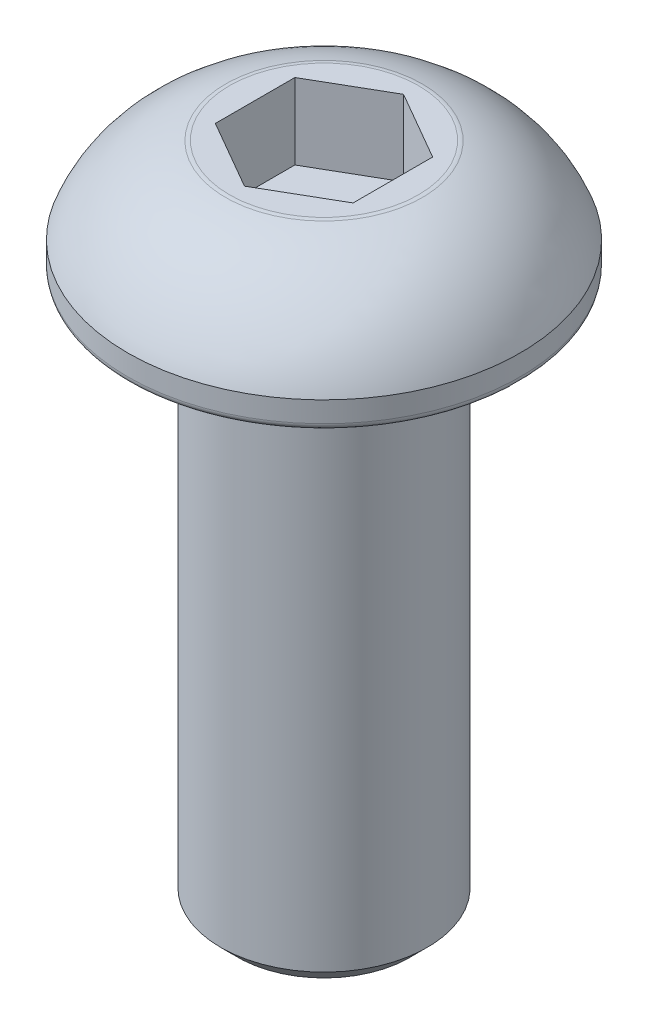
ISO-10303-21;
HEADER;
FILE_DESCRIPTION(('STEP AP214'),'2;1');
FILE_NAME('part.step','',(''),(''),'','','');
FILE_SCHEMA(('AUTOMOTIVE_DESIGN { 1 0 10303 214 1 1 1 1 }'));
ENDSEC;
DATA;
#1=APPLICATION_CONTEXT('core data for automotive mechanical design processes');
#2=APPLICATION_PROTOCOL_DEFINITION('international standard','automotive_design',2000,#1);
#3=PRODUCT_CONTEXT('',#1,'mechanical');
#4=PRODUCT('Part','Part','',(#3));
#5=PRODUCT_RELATED_PRODUCT_CATEGORY('part','',(#4));
#6=PRODUCT_DEFINITION_FORMATION('','',#4);
#7=PRODUCT_DEFINITION_CONTEXT('part definition',#1,'design');
#8=PRODUCT_DEFINITION('design','',#6,#7);
#9=PRODUCT_DEFINITION_SHAPE('','',#8);
#10=(LENGTH_UNIT() NAMED_UNIT(*) SI_UNIT(.MILLI.,.METRE.));
#11=(NAMED_UNIT(*) PLANE_ANGLE_UNIT() SI_UNIT($,.RADIAN.));
#12=(NAMED_UNIT(*) SI_UNIT($,.STERADIAN.) SOLID_ANGLE_UNIT());
#13=UNCERTAINTY_MEASURE_WITH_UNIT(LENGTH_MEASURE(1.E-05),#10,'distance_accuracy_value','');
#14=(GEOMETRIC_REPRESENTATION_CONTEXT(3) GLOBAL_UNCERTAINTY_ASSIGNED_CONTEXT((#13)) GLOBAL_UNIT_ASSIGNED_CONTEXT((#10,
#11,#12)) REPRESENTATION_CONTEXT('',''));
#15=CARTESIAN_POINT('',(0.,0.,0.));
#16=DIRECTION('',(0.,0.,1.));
#17=DIRECTION('',(1.,0.,0.));
#18=AXIS2_PLACEMENT_3D('',#15,#16,#17);
#19=CARTESIAN_POINT('',(0.,0.0999999999999998,0.));
#20=DIRECTION('',(0.,-1.,0.));
#21=DIRECTION('',(0.,0.,-1.));
#22=AXIS2_PLACEMENT_3D('',#19,#20,#21);
#23=TOROIDAL_SURFACE('',#22,2.75,0.0999999999999999);
#24=CARTESIAN_POINT('',(0.,0.,0.));
#25=DIRECTION('',(0.,-1.,0.));
#26=DIRECTION('',(0.,0.,-1.));
#27=AXIS2_PLACEMENT_3D('',#24,#25,#26);
#28=CIRCLE('',#27,2.75);
#29=CARTESIAN_POINT('',(0.,0.,-2.75));
#30=VERTEX_POINT('',#29);
#31=EDGE_CURVE('E138',#30,#30,#28,.T.);
#32=ORIENTED_EDGE('',*,*,#31,.F.);
#33=EDGE_LOOP('',(#32));
#34=FACE_BOUND('',#33,.T.);
#35=CARTESIAN_POINT('',(0.,0.100000000000001,0.));
#36=DIRECTION('',(0.,-1.,0.));
#37=DIRECTION('',(0.,0.,-1.));
#38=AXIS2_PLACEMENT_3D('',#35,#36,#37);
#39=CIRCLE('',#38,2.85);
#40=CARTESIAN_POINT('',(0.,0.100000000000001,-2.85));
#41=VERTEX_POINT('',#40);
#42=EDGE_CURVE('E11',#41,#41,#39,.T.);
#43=ORIENTED_EDGE('',*,*,#42,.T.);
#44=EDGE_LOOP('',(#43));
#45=FACE_BOUND('',#44,.T.);
#46=ADVANCED_FACE('F37',(#34,#45),#23,.T.);
#47=CARTESIAN_POINT('',(0.,-8.,0.));
#48=DIRECTION('',(0.,-1.,0.));
#49=DIRECTION('',(0.,0.,-1.));
#50=AXIS2_PLACEMENT_3D('',#47,#48,#49);
#51=CYLINDRICAL_SURFACE('',#50,2.85);
#52=ORIENTED_EDGE('',*,*,#42,.F.);
#53=EDGE_LOOP('',(#52));
#54=FACE_BOUND('',#53,.T.);
#55=CARTESIAN_POINT('',(0.,0.399999999999999,0.));
#56=DIRECTION('',(0.,-1.,0.));
#57=DIRECTION('',(0.,0.,-1.));
#58=AXIS2_PLACEMENT_3D('',#55,#56,#57);
#59=CIRCLE('',#58,2.85);
#60=CARTESIAN_POINT('',(0.,0.399999999999999,-2.85));
#61=VERTEX_POINT('',#60);
#62=EDGE_CURVE('E44',#61,#61,#59,.T.);
#63=ORIENTED_EDGE('',*,*,#62,.T.);
#64=EDGE_LOOP('',(#63));
#65=FACE_BOUND('',#64,.T.);
#66=ADVANCED_FACE('F166',(#54,#65),#51,.T.);
#67=CARTESIAN_POINT('',(0.,-0.305058043743636,0.));
#68=DIRECTION('',(0.,-1.,0.));
#69=DIRECTION('',(0.,0.,-1.));
#70=AXIS2_PLACEMENT_3D('',#67,#68,#69);
#71=DEGENERATE_TOROIDAL_SURFACE('',#70,0.978398238152038,2.,.T.);
#72=ORIENTED_EDGE('',*,*,#62,.F.);
#73=EDGE_LOOP('',(#72));
#74=FACE_BOUND('',#73,.T.);
#75=CARTESIAN_POINT('',(0.,1.6435797205348,0.));
#76=DIRECTION('',(0.,-1.,0.));
#77=DIRECTION('',(0.,0.,-1.));
#78=AXIS2_PLACEMENT_3D('',#75,#76,#77);
#79=CIRCLE('',#78,1.42874350972477);
#80=CARTESIAN_POINT('',(0.,1.6435797205348,-1.42874350972477));
#81=VERTEX_POINT('',#80);
#82=EDGE_CURVE('E161',#81,#81,#79,.T.);
#83=ORIENTED_EDGE('',*,*,#82,.T.);
#84=EDGE_LOOP('',(#83));
#85=FACE_BOUND('',#84,.T.);
#86=ADVANCED_FACE('F168',(#74,#85),#71,.T.);
#87=CARTESIAN_POINT('',(0.,1.4,0.));
#88=DIRECTION('',(0.,-1.,0.));
#89=DIRECTION('',(0.,0.,-1.));
#90=AXIS2_PLACEMENT_3D('',#87,#88,#89);
#91=TOROIDAL_SURFACE('',#90,1.37245035077818,0.25);
#92=ORIENTED_EDGE('',*,*,#82,.F.);
#93=EDGE_LOOP('',(#92));
#94=FACE_BOUND('',#93,.T.);
#95=CARTESIAN_POINT('',(0.,1.65,0.));
#96=DIRECTION('',(0.,-1.,0.));
#97=DIRECTION('',(0.,0.,-1.));
#98=AXIS2_PLACEMENT_3D('',#95,#96,#97);
#99=CIRCLE('',#98,1.37245035077818);
#100=CARTESIAN_POINT('',(0.,1.65,-1.37245035077818));
#101=VERTEX_POINT('',#100);
#102=EDGE_CURVE('E158',#101,#101,#99,.T.);
#103=ORIENTED_EDGE('',*,*,#102,.T.);
#104=EDGE_LOOP('',(#103));
#105=FACE_BOUND('',#104,.T.);
#106=ADVANCED_FACE('F171',(#94,#105),#91,.T.);
#107=CARTESIAN_POINT('',(-1.37245035077818,1.65,0.));
#108=DIRECTION('',(0.,-1.,0.));
#109=DIRECTION('',(0.,0.,-1.));
#110=AXIS2_PLACEMENT_3D('',#107,#108,#109);
#111=PLANE('',#110);
#112=DIRECTION('',(0.,0.,1.));
#113=VECTOR('',#112,1.);
#114=CARTESIAN_POINT('',(-1.,1.65,-0.577350269189625));
#115=LINE('',#114,#113);
#116=CARTESIAN_POINT('',(-1.,1.65,-0.577350269189625));
#117=VERTEX_POINT('',#116);
#118=CARTESIAN_POINT('',(-1.,1.65,0.577350269189626));
#119=VERTEX_POINT('',#118);
#120=EDGE_CURVE('E125',#117,#119,#115,.T.);
#121=ORIENTED_EDGE('',*,*,#120,.F.);
#122=DIRECTION('',(-0.866025403784438,0.,0.5));
#123=VECTOR('',#122,1.);
#124=CARTESIAN_POINT('',(0.,1.65,-1.15470053837925));
#125=LINE('',#124,#123);
#126=CARTESIAN_POINT('',(0.,1.65,-1.15470053837925));
#127=VERTEX_POINT('',#126);
#128=EDGE_CURVE('E51',#127,#117,#125,.T.);
#129=ORIENTED_EDGE('',*,*,#128,.F.);
#130=DIRECTION('',(-0.866025403784439,0.,-0.5));
#131=VECTOR('',#130,1.);
#132=CARTESIAN_POINT('',(1.,1.65,-0.577350269189626));
#133=LINE('',#132,#131);
#134=CARTESIAN_POINT('',(1.,1.65,-0.577350269189626));
#135=VERTEX_POINT('',#134);
#136=EDGE_CURVE('E134',#135,#127,#133,.T.);
#137=ORIENTED_EDGE('',*,*,#136,.F.);
#138=DIRECTION('',(0.,0.,-1.));
#139=VECTOR('',#138,1.);
#140=CARTESIAN_POINT('',(1.,1.65,0.577350269189625));
#141=LINE('',#140,#139);
#142=CARTESIAN_POINT('',(1.,1.65,0.577350269189625));
#143=VERTEX_POINT('',#142);
#144=EDGE_CURVE('E132',#143,#135,#141,.T.);
#145=ORIENTED_EDGE('',*,*,#144,.F.);
#146=DIRECTION('',(0.866025403784438,0.,-0.5));
#147=VECTOR('',#146,1.);
#148=CARTESIAN_POINT('',(0.,1.65,1.15470053837925));
#149=LINE('',#148,#147);
#150=CARTESIAN_POINT('',(0.,1.65,1.15470053837925));
#151=VERTEX_POINT('',#150);
#152=EDGE_CURVE('E99',#151,#143,#149,.T.);
#153=ORIENTED_EDGE('',*,*,#152,.F.);
#154=DIRECTION('',(0.866025403784439,0.,0.5));
#155=VECTOR('',#154,1.);
#156=CARTESIAN_POINT('',(-1.,1.65,0.577350269189626));
#157=LINE('',#156,#155);
#158=EDGE_CURVE('E128',#119,#151,#157,.T.);
#159=ORIENTED_EDGE('',*,*,#158,.F.);
#160=EDGE_LOOP('',(#121,#129,#137,#145,#153,#159));
#161=FACE_BOUND('',#160,.T.);
#162=ORIENTED_EDGE('',*,*,#102,.F.);
#163=EDGE_LOOP('',(#162));
#164=FACE_BOUND('',#163,.T.);
#165=ADVANCED_FACE('F177',(#161,#164),#111,.F.);
#166=CARTESIAN_POINT('',(-1.25,-8.,0.));
#167=DIRECTION('',(0.,1.,0.));
#168=DIRECTION('',(0.,0.,1.));
#169=AXIS2_PLACEMENT_3D('',#166,#167,#168);
#170=PLANE('',#169);
#171=CARTESIAN_POINT('',(0.,-8.,0.));
#172=DIRECTION('',(0.,-1.,0.));
#173=DIRECTION('',(0.,0.,-1.));
#174=AXIS2_PLACEMENT_3D('',#171,#172,#173);
#175=CIRCLE('',#174,1.25);
#176=CARTESIAN_POINT('',(0.,-8.,-1.25));
#177=VERTEX_POINT('',#176);
#178=EDGE_CURVE('E155',#177,#177,#175,.T.);
#179=ORIENTED_EDGE('',*,*,#178,.T.);
#180=EDGE_LOOP('',(#179));
#181=FACE_BOUND('',#180,.T.);
#182=ADVANCED_FACE('F182',(#181),#170,.F.);
#183=CARTESIAN_POINT('',(0.,-7.75,0.));
#184=DIRECTION('',(0.,1.,0.));
#185=DIRECTION('',(0.,0.,1.));
#186=AXIS2_PLACEMENT_3D('',#183,#184,#185);
#187=CONICAL_SURFACE('',#186,1.5,0.785398163397451);
#188=ORIENTED_EDGE('',*,*,#178,.F.);
#189=EDGE_LOOP('',(#188));
#190=FACE_BOUND('',#189,.T.);
#191=CARTESIAN_POINT('',(0.,-7.75,0.));
#192=DIRECTION('',(0.,-1.,0.));
#193=DIRECTION('',(0.,0.,-1.));
#194=AXIS2_PLACEMENT_3D('',#191,#192,#193);
#195=CIRCLE('',#194,1.5);
#196=CARTESIAN_POINT('',(0.,-7.75,-1.5));
#197=VERTEX_POINT('',#196);
#198=EDGE_CURVE('E152',#197,#197,#195,.T.);
#199=ORIENTED_EDGE('',*,*,#198,.T.);
#200=EDGE_LOOP('',(#199));
#201=FACE_BOUND('',#200,.T.);
#202=ADVANCED_FACE('F188',(#190,#201),#187,.T.);
#203=CARTESIAN_POINT('',(0.,-8.,0.));
#204=DIRECTION('',(0.,-1.,0.));
#205=DIRECTION('',(0.,0.,-1.));
#206=AXIS2_PLACEMENT_3D('',#203,#204,#205);
#207=CYLINDRICAL_SURFACE('',#206,1.5);
#208=ORIENTED_EDGE('',*,*,#198,.F.);
#209=EDGE_LOOP('',(#208));
#210=FACE_BOUND('',#209,.T.);
#211=CARTESIAN_POINT('',(0.,-0.100000000000001,0.));
#212=DIRECTION('',(0.,-1.,0.));
#213=DIRECTION('',(0.,0.,-1.));
#214=AXIS2_PLACEMENT_3D('',#211,#212,#213);
#215=CIRCLE('',#214,1.5);
#216=CARTESIAN_POINT('',(0.,-0.100000000000001,-1.5));
#217=VERTEX_POINT('',#216);
#218=EDGE_CURVE('E149',#217,#217,#215,.T.);
#219=ORIENTED_EDGE('',*,*,#218,.T.);
#220=EDGE_LOOP('',(#219));
#221=FACE_BOUND('',#220,.T.);
#222=ADVANCED_FACE('F214',(#210,#221),#207,.T.);
#223=CARTESIAN_POINT('',(0.,-0.1,0.));
#224=DIRECTION('',(0.,-1.,0.));
#225=DIRECTION('',(0.,0.,-1.));
#226=AXIS2_PLACEMENT_3D('',#223,#224,#225);
#227=TOROIDAL_SURFACE('',#226,1.6,0.1);
#228=ORIENTED_EDGE('',*,*,#218,.F.);
#229=EDGE_LOOP('',(#228));
#230=FACE_BOUND('',#229,.T.);
#231=CARTESIAN_POINT('',(0.,0.,0.));
#232=DIRECTION('',(0.,-1.,0.));
#233=DIRECTION('',(0.,0.,-1.));
#234=AXIS2_PLACEMENT_3D('',#231,#232,#233);
#235=CIRCLE('',#234,1.6);
#236=CARTESIAN_POINT('',(0.,0.,-1.6));
#237=VERTEX_POINT('',#236);
#238=EDGE_CURVE('E146',#237,#237,#235,.T.);
#239=ORIENTED_EDGE('',*,*,#238,.T.);
#240=EDGE_LOOP('',(#239));
#241=FACE_BOUND('',#240,.T.);
#242=ADVANCED_FACE('F205',(#230,#241),#227,.F.);
#243=CARTESIAN_POINT('',(-1.6,0.,0.));
#244=DIRECTION('',(0.,1.,0.));
#245=DIRECTION('',(0.,0.,1.));
#246=AXIS2_PLACEMENT_3D('',#243,#244,#245);
#247=PLANE('',#246);
#248=ORIENTED_EDGE('',*,*,#238,.F.);
#249=EDGE_LOOP('',(#248));
#250=FACE_BOUND('',#249,.T.);
#251=ORIENTED_EDGE('',*,*,#31,.T.);
#252=EDGE_LOOP('',(#251));
#253=FACE_BOUND('',#252,.T.);
#254=ADVANCED_FACE('F202',(#250,#253),#247,.F.);
#255=CARTESIAN_POINT('',(0.,0.55,-1.15470053837925));
#256=DIRECTION('',(-0.5,0.,-0.866025403784438));
#257=DIRECTION('',(-0.866025403784438,0.,0.5));
#258=AXIS2_PLACEMENT_3D('',#255,#256,#257);
#259=PLANE('',#258);
#260=ORIENTED_EDGE('',*,*,#128,.T.);
#261=DIRECTION('',(0.,1.,0.));
#262=VECTOR('',#261,1.);
#263=CARTESIAN_POINT('',(-1.,0.55,-0.577350269189625));
#264=LINE('',#263,#262);
#265=CARTESIAN_POINT('',(-1.,0.55,-0.577350269189625));
#266=VERTEX_POINT('',#265);
#267=EDGE_CURVE('E81',#266,#117,#264,.T.);
#268=ORIENTED_EDGE('',*,*,#267,.F.);
#269=DIRECTION('',(-0.866025403784438,0.,0.5));
#270=VECTOR('',#269,1.);
#271=CARTESIAN_POINT('',(0.,0.55,-1.15470053837925));
#272=LINE('',#271,#270);
#273=CARTESIAN_POINT('',(0.,0.55,-1.15470053837925));
#274=VERTEX_POINT('',#273);
#275=EDGE_CURVE('E136',#274,#266,#272,.T.);
#276=ORIENTED_EDGE('',*,*,#275,.F.);
#277=DIRECTION('',(0.,1.,0.));
#278=VECTOR('',#277,1.);
#279=CARTESIAN_POINT('',(0.,0.55,-1.15470053837925));
#280=LINE('',#279,#278);
#281=EDGE_CURVE('E59',#274,#127,#280,.T.);
#282=ORIENTED_EDGE('',*,*,#281,.T.);
#283=EDGE_LOOP('',(#260,#268,#276,#282));
#284=FACE_BOUND('',#283,.T.);
#285=ADVANCED_FACE('F204',(#284),#259,.F.);
#286=CARTESIAN_POINT('',(1.,0.55,-0.577350269189626));
#287=DIRECTION('',(0.5,0.,-0.866025403784439));
#288=DIRECTION('',(-0.866025403784439,0.,-0.5));
#289=AXIS2_PLACEMENT_3D('',#286,#287,#288);
#290=PLANE('',#289);
#291=ORIENTED_EDGE('',*,*,#136,.T.);
#292=ORIENTED_EDGE('',*,*,#281,.F.);
#293=DIRECTION('',(-0.866025403784439,0.,-0.5));
#294=VECTOR('',#293,1.);
#295=CARTESIAN_POINT('',(1.,0.55,-0.577350269189626));
#296=LINE('',#295,#294);
#297=CARTESIAN_POINT('',(1.,0.55,-0.577350269189626));
#298=VERTEX_POINT('',#297);
#299=EDGE_CURVE('E111',#298,#274,#296,.T.);
#300=ORIENTED_EDGE('',*,*,#299,.F.);
#301=DIRECTION('',(0.,1.,0.));
#302=VECTOR('',#301,1.);
#303=CARTESIAN_POINT('',(1.,0.55,-0.577350269189626));
#304=LINE('',#303,#302);
#305=EDGE_CURVE('E103',#298,#135,#304,.T.);
#306=ORIENTED_EDGE('',*,*,#305,.T.);
#307=EDGE_LOOP('',(#291,#292,#300,#306));
#308=FACE_BOUND('',#307,.T.);
#309=ADVANCED_FACE('F212',(#308),#290,.F.);
#310=CARTESIAN_POINT('',(1.,0.55,0.577350269189625));
#311=DIRECTION('',(1.,0.,0.));
#312=DIRECTION('',(0.,0.,-1.));
#313=AXIS2_PLACEMENT_3D('',#310,#311,#312);
#314=PLANE('',#313);
#315=ORIENTED_EDGE('',*,*,#144,.T.);
#316=ORIENTED_EDGE('',*,*,#305,.F.);
#317=DIRECTION('',(0.,0.,-1.));
#318=VECTOR('',#317,1.);
#319=CARTESIAN_POINT('',(1.,0.55,0.577350269189625));
#320=LINE('',#319,#318);
#321=CARTESIAN_POINT('',(1.,0.55,0.577350269189625));
#322=VERTEX_POINT('',#321);
#323=EDGE_CURVE('E107',#322,#298,#320,.T.);
#324=ORIENTED_EDGE('',*,*,#323,.F.);
#325=DIRECTION('',(0.,1.,0.));
#326=VECTOR('',#325,1.);
#327=CARTESIAN_POINT('',(1.,0.55,0.577350269189625));
#328=LINE('',#327,#326);
#329=EDGE_CURVE('E92',#322,#143,#328,.T.);
#330=ORIENTED_EDGE('',*,*,#329,.T.);
#331=EDGE_LOOP('',(#315,#316,#324,#330));
#332=FACE_BOUND('',#331,.T.);
#333=ADVANCED_FACE('F108',(#332),#314,.F.);
#334=CARTESIAN_POINT('',(0.,0.55,1.15470053837925));
#335=DIRECTION('',(0.5,0.,0.866025403784438));
#336=DIRECTION('',(0.866025403784438,0.,-0.5));
#337=AXIS2_PLACEMENT_3D('',#334,#335,#336);
#338=PLANE('',#337);
#339=ORIENTED_EDGE('',*,*,#152,.T.);
#340=ORIENTED_EDGE('',*,*,#329,.F.);
#341=DIRECTION('',(0.866025403784438,0.,-0.5));
#342=VECTOR('',#341,1.);
#343=CARTESIAN_POINT('',(0.,0.55,1.15470053837925));
#344=LINE('',#343,#342);
#345=CARTESIAN_POINT('',(0.,0.55,1.15470053837925));
#346=VERTEX_POINT('',#345);
#347=EDGE_CURVE('E96',#346,#322,#344,.T.);
#348=ORIENTED_EDGE('',*,*,#347,.F.);
#349=DIRECTION('',(0.,1.,0.));
#350=VECTOR('',#349,1.);
#351=CARTESIAN_POINT('',(0.,0.55,1.15470053837925));
#352=LINE('',#351,#350);
#353=EDGE_CURVE('E104',#346,#151,#352,.T.);
#354=ORIENTED_EDGE('',*,*,#353,.T.);
#355=EDGE_LOOP('',(#339,#340,#348,#354));
#356=FACE_BOUND('',#355,.T.);
#357=ADVANCED_FACE('F94',(#356),#338,.F.);
#358=CARTESIAN_POINT('',(-1.,0.55,0.577350269189626));
#359=DIRECTION('',(-0.5,0.,0.866025403784438));
#360=DIRECTION('',(0.866025403784439,0.,0.5));
#361=AXIS2_PLACEMENT_3D('',#358,#359,#360);
#362=PLANE('',#361);
#363=ORIENTED_EDGE('',*,*,#158,.T.);
#364=ORIENTED_EDGE('',*,*,#353,.F.);
#365=DIRECTION('',(0.866025403784439,0.,0.5));
#366=VECTOR('',#365,1.);
#367=CARTESIAN_POINT('',(-1.,0.55,0.577350269189626));
#368=LINE('',#367,#366);
#369=CARTESIAN_POINT('',(-1.,0.55,0.577350269189626));
#370=VERTEX_POINT('',#369);
#371=EDGE_CURVE('E117',#370,#346,#368,.T.);
#372=ORIENTED_EDGE('',*,*,#371,.F.);
#373=DIRECTION('',(0.,1.,0.));
#374=VECTOR('',#373,1.);
#375=CARTESIAN_POINT('',(-1.,0.55,0.577350269189626));
#376=LINE('',#375,#374);
#377=EDGE_CURVE('E141',#370,#119,#376,.T.);
#378=ORIENTED_EDGE('',*,*,#377,.T.);
#379=EDGE_LOOP('',(#363,#364,#372,#378));
#380=FACE_BOUND('',#379,.T.);
#381=ADVANCED_FACE('F284',(#380),#362,.F.);
#382=CARTESIAN_POINT('',(-1.,0.55,-0.577350269189625));
#383=DIRECTION('',(-1.,0.,0.));
#384=DIRECTION('',(0.,0.,1.));
#385=AXIS2_PLACEMENT_3D('',#382,#383,#384);
#386=PLANE('',#385);
#387=ORIENTED_EDGE('',*,*,#120,.T.);
#388=ORIENTED_EDGE('',*,*,#377,.F.);
#389=DIRECTION('',(0.,0.,1.));
#390=VECTOR('',#389,1.);
#391=CARTESIAN_POINT('',(-1.,0.55,-0.577350269189625));
#392=LINE('',#391,#390);
#393=EDGE_CURVE('E119',#266,#370,#392,.T.);
#394=ORIENTED_EDGE('',*,*,#393,.F.);
#395=ORIENTED_EDGE('',*,*,#267,.T.);
#396=EDGE_LOOP('',(#387,#388,#394,#395));
#397=FACE_BOUND('',#396,.T.);
#398=ADVANCED_FACE('F293',(#397),#386,.F.);
#399=CARTESIAN_POINT('',(0.,0.55,0.));
#400=DIRECTION('',(0.,1.,0.));
#401=DIRECTION('',(0.,0.,1.));
#402=AXIS2_PLACEMENT_3D('',#399,#400,#401);
#403=PLANE('',#402);
#404=ORIENTED_EDGE('',*,*,#275,.T.);
#405=ORIENTED_EDGE('',*,*,#393,.T.);
#406=ORIENTED_EDGE('',*,*,#371,.T.);
#407=ORIENTED_EDGE('',*,*,#347,.T.);
#408=ORIENTED_EDGE('',*,*,#323,.T.);
#409=ORIENTED_EDGE('',*,*,#299,.T.);
#410=EDGE_LOOP('',(#404,#405,#406,#407,#408,#409));
#411=FACE_BOUND('',#410,.T.);
#412=ADVANCED_FACE('F114',(#411),#403,.T.);
#413=CLOSED_SHELL('',(#46,#66,#86,#106,#165,#182,#202,#222,#242,#254,#285,#309,#333,#357,#381,
#398,#412));
#414=MANIFOLD_SOLID_BREP('B2',#413);
#415=ADVANCED_BREP_SHAPE_REPRESENTATION('',(#18,#414),#14);
#416=SHAPE_DEFINITION_REPRESENTATION(#9,#415);
ENDSEC;
END-ISO-10303-21;
